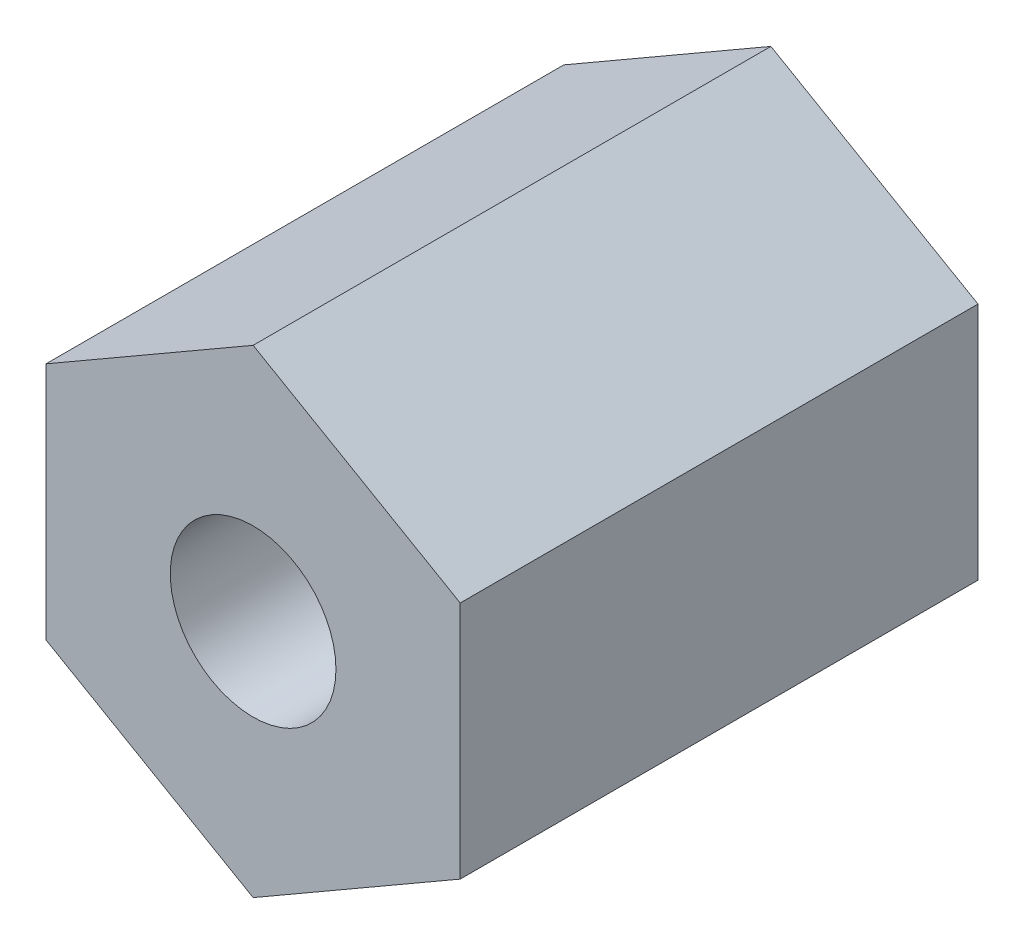
ISO-10303-21;
HEADER;
FILE_DESCRIPTION(('STEP AP214'),'2;1');
FILE_NAME('part.step','',(''),(''),'','','');
FILE_SCHEMA(('AUTOMOTIVE_DESIGN { 1 0 10303 214 1 1 1 1 }'));
ENDSEC;
DATA;
#1=APPLICATION_CONTEXT('core data for automotive mechanical design processes');
#2=APPLICATION_PROTOCOL_DEFINITION('international standard','automotive_design',2000,#1);
#3=PRODUCT_CONTEXT('',#1,'mechanical');
#4=PRODUCT('Part','Part','',(#3));
#5=PRODUCT_RELATED_PRODUCT_CATEGORY('part','',(#4));
#6=PRODUCT_DEFINITION_FORMATION('','',#4);
#7=PRODUCT_DEFINITION_CONTEXT('part definition',#1,'design');
#8=PRODUCT_DEFINITION('design','',#6,#7);
#9=PRODUCT_DEFINITION_SHAPE('','',#8);
#10=(LENGTH_UNIT() NAMED_UNIT(*) SI_UNIT(.MILLI.,.METRE.));
#11=(NAMED_UNIT(*) PLANE_ANGLE_UNIT() SI_UNIT($,.RADIAN.));
#12=(NAMED_UNIT(*) SI_UNIT($,.STERADIAN.) SOLID_ANGLE_UNIT());
#13=UNCERTAINTY_MEASURE_WITH_UNIT(LENGTH_MEASURE(1.E-05),#10,'distance_accuracy_value','');
#14=(GEOMETRIC_REPRESENTATION_CONTEXT(3) GLOBAL_UNCERTAINTY_ASSIGNED_CONTEXT((#13)) GLOBAL_UNIT_ASSIGNED_CONTEXT((#10,
#11,#12)) REPRESENTATION_CONTEXT('',''));
#15=CARTESIAN_POINT('',(0.,0.,0.));
#16=DIRECTION('',(0.,0.,1.));
#17=DIRECTION('',(1.,0.,0.));
#18=AXIS2_PLACEMENT_3D('',#15,#16,#17);
#19=CARTESIAN_POINT('',(0.,0.,5.));
#20=DIRECTION('',(0.,0.,1.));
#21=DIRECTION('',(1.,0.,0.));
#22=AXIS2_PLACEMENT_3D('',#19,#20,#21);
#23=PLANE('',#22);
#24=DIRECTION('',(0.,1.,0.));
#25=VECTOR('',#24,1.);
#26=CARTESIAN_POINT('',(2.,-1.15470053837925,5.));
#27=LINE('',#26,#25);
#28=CARTESIAN_POINT('',(2.,-1.15470053837925,5.));
#29=VERTEX_POINT('',#28);
#30=CARTESIAN_POINT('',(2.,1.15470053837925,5.));
#31=VERTEX_POINT('',#30);
#32=EDGE_CURVE('E137',#29,#31,#27,.T.);
#33=ORIENTED_EDGE('',*,*,#32,.T.);
#34=DIRECTION('',(-0.866025403784439,0.5,0.));
#35=VECTOR('',#34,1.);
#36=CARTESIAN_POINT('',(2.,1.15470053837925,5.));
#37=LINE('',#36,#35);
#38=CARTESIAN_POINT('',(0.,2.3094010767585,5.));
#39=VERTEX_POINT('',#38);
#40=EDGE_CURVE('E95',#31,#39,#37,.T.);
#41=ORIENTED_EDGE('',*,*,#40,.T.);
#42=DIRECTION('',(-0.866025403784439,-0.5,0.));
#43=VECTOR('',#42,1.);
#44=CARTESIAN_POINT('',(0.,2.3094010767585,5.));
#45=LINE('',#44,#43);
#46=CARTESIAN_POINT('',(-2.,1.15470053837925,5.));
#47=VERTEX_POINT('',#46);
#48=EDGE_CURVE('E108',#39,#47,#45,.T.);
#49=ORIENTED_EDGE('',*,*,#48,.T.);
#50=DIRECTION('',(0.,-1.,0.));
#51=VECTOR('',#50,1.);
#52=CARTESIAN_POINT('',(-2.,1.15470053837925,5.));
#53=LINE('',#52,#51);
#54=CARTESIAN_POINT('',(-2.,-1.15470053837925,5.));
#55=VERTEX_POINT('',#54);
#56=EDGE_CURVE('E102',#47,#55,#53,.T.);
#57=ORIENTED_EDGE('',*,*,#56,.T.);
#58=DIRECTION('',(0.866025403784439,-0.5,0.));
#59=VECTOR('',#58,1.);
#60=CARTESIAN_POINT('',(-2.,-1.15470053837925,5.));
#61=LINE('',#60,#59);
#62=CARTESIAN_POINT('',(0.,-2.3094010767585,5.));
#63=VERTEX_POINT('',#62);
#64=EDGE_CURVE('E106',#55,#63,#61,.T.);
#65=ORIENTED_EDGE('',*,*,#64,.T.);
#66=DIRECTION('',(0.866025403784439,0.5,0.));
#67=VECTOR('',#66,1.);
#68=CARTESIAN_POINT('',(0.,-2.3094010767585,5.));
#69=LINE('',#68,#67);
#70=EDGE_CURVE('E58',#63,#29,#69,.T.);
#71=ORIENTED_EDGE('',*,*,#70,.T.);
#72=EDGE_LOOP('',(#33,#41,#49,#57,#65,#71));
#73=FACE_BOUND('',#72,.T.);
#74=CARTESIAN_POINT('',(0.,0.,5.));
#75=DIRECTION('',(0.,0.,1.));
#76=DIRECTION('',(1.,0.,0.));
#77=AXIS2_PLACEMENT_3D('',#74,#75,#76);
#78=CIRCLE('',#77,0.8);
#79=CARTESIAN_POINT('',(0.8,0.,5.));
#80=VERTEX_POINT('',#79);
#81=EDGE_CURVE('E130',#80,#80,#78,.T.);
#82=ORIENTED_EDGE('',*,*,#81,.F.);
#83=EDGE_LOOP('',(#82));
#84=FACE_BOUND('',#83,.T.);
#85=ADVANCED_FACE('F41',(#73,#84),#23,.T.);
#86=CARTESIAN_POINT('',(0.,0.,0.));
#87=DIRECTION('',(0.,0.,1.));
#88=DIRECTION('',(1.,0.,0.));
#89=AXIS2_PLACEMENT_3D('',#86,#87,#88);
#90=PLANE('',#89);
#91=DIRECTION('',(0.,1.,0.));
#92=VECTOR('',#91,1.);
#93=CARTESIAN_POINT('',(2.,-1.15470053837925,0.));
#94=LINE('',#93,#92);
#95=CARTESIAN_POINT('',(2.,-1.15470053837925,0.));
#96=VERTEX_POINT('',#95);
#97=CARTESIAN_POINT('',(2.,1.15470053837925,0.));
#98=VERTEX_POINT('',#97);
#99=EDGE_CURVE('E126',#96,#98,#94,.T.);
#100=ORIENTED_EDGE('',*,*,#99,.F.);
#101=DIRECTION('',(0.866025403784439,0.5,0.));
#102=VECTOR('',#101,1.);
#103=CARTESIAN_POINT('',(0.,-2.3094010767585,0.));
#104=LINE('',#103,#102);
#105=CARTESIAN_POINT('',(0.,-2.3094010767585,0.));
#106=VERTEX_POINT('',#105);
#107=EDGE_CURVE('E87',#106,#96,#104,.T.);
#108=ORIENTED_EDGE('',*,*,#107,.F.);
#109=DIRECTION('',(0.866025403784439,-0.5,0.));
#110=VECTOR('',#109,1.);
#111=CARTESIAN_POINT('',(-2.,-1.15470053837925,0.));
#112=LINE('',#111,#110);
#113=CARTESIAN_POINT('',(-2.,-1.15470053837925,0.));
#114=VERTEX_POINT('',#113);
#115=EDGE_CURVE('E81',#114,#106,#112,.T.);
#116=ORIENTED_EDGE('',*,*,#115,.F.);
#117=DIRECTION('',(0.,-1.,0.));
#118=VECTOR('',#117,1.);
#119=CARTESIAN_POINT('',(-2.,1.15470053837925,0.));
#120=LINE('',#119,#118);
#121=CARTESIAN_POINT('',(-2.,1.15470053837925,0.));
#122=VERTEX_POINT('',#121);
#123=EDGE_CURVE('E116',#122,#114,#120,.T.);
#124=ORIENTED_EDGE('',*,*,#123,.F.);
#125=DIRECTION('',(-0.866025403784439,-0.5,0.));
#126=VECTOR('',#125,1.);
#127=CARTESIAN_POINT('',(0.,2.3094010767585,0.));
#128=LINE('',#127,#126);
#129=CARTESIAN_POINT('',(0.,2.3094010767585,0.));
#130=VERTEX_POINT('',#129);
#131=EDGE_CURVE('E132',#130,#122,#128,.T.);
#132=ORIENTED_EDGE('',*,*,#131,.F.);
#133=DIRECTION('',(-0.866025403784439,0.5,0.));
#134=VECTOR('',#133,1.);
#135=CARTESIAN_POINT('',(2.,1.15470053837925,0.));
#136=LINE('',#135,#134);
#137=EDGE_CURVE('E129',#98,#130,#136,.T.);
#138=ORIENTED_EDGE('',*,*,#137,.F.);
#139=EDGE_LOOP('',(#100,#108,#116,#124,#132,#138));
#140=FACE_BOUND('',#139,.T.);
#141=CARTESIAN_POINT('',(0.,0.,0.));
#142=DIRECTION('',(0.,0.,1.));
#143=DIRECTION('',(1.,0.,0.));
#144=AXIS2_PLACEMENT_3D('',#141,#142,#143);
#145=CIRCLE('',#144,0.8);
#146=CARTESIAN_POINT('',(0.8,0.,0.));
#147=VERTEX_POINT('',#146);
#148=EDGE_CURVE('E230',#147,#147,#145,.T.);
#149=ORIENTED_EDGE('',*,*,#148,.T.);
#150=EDGE_LOOP('',(#149));
#151=FACE_BOUND('',#150,.T.);
#152=ADVANCED_FACE('F146',(#140,#151),#90,.F.);
#153=CARTESIAN_POINT('',(2.,-1.15470053837925,5.));
#154=DIRECTION('',(-1.,0.,0.));
#155=DIRECTION('',(0.,0.,1.));
#156=AXIS2_PLACEMENT_3D('',#153,#154,#155);
#157=PLANE('',#156);
#158=ORIENTED_EDGE('',*,*,#99,.T.);
#159=DIRECTION('',(0.,0.,-1.));
#160=VECTOR('',#159,1.);
#161=CARTESIAN_POINT('',(2.,1.15470053837925,5.));
#162=LINE('',#161,#160);
#163=EDGE_CURVE('E11',#31,#98,#162,.T.);
#164=ORIENTED_EDGE('',*,*,#163,.F.);
#165=ORIENTED_EDGE('',*,*,#32,.F.);
#166=DIRECTION('',(0.,0.,-1.));
#167=VECTOR('',#166,1.);
#168=CARTESIAN_POINT('',(2.,-1.15470053837925,5.));
#169=LINE('',#168,#167);
#170=EDGE_CURVE('E122',#29,#96,#169,.T.);
#171=ORIENTED_EDGE('',*,*,#170,.T.);
#172=EDGE_LOOP('',(#158,#164,#165,#171));
#173=FACE_BOUND('',#172,.T.);
#174=ADVANCED_FACE('F43',(#173),#157,.F.);
#175=CARTESIAN_POINT('',(2.,1.15470053837925,5.));
#176=DIRECTION('',(-0.5,-0.866025403784439,0.));
#177=DIRECTION('',(0.866025403784439,-0.5,0.));
#178=AXIS2_PLACEMENT_3D('',#175,#176,#177);
#179=PLANE('',#178);
#180=ORIENTED_EDGE('',*,*,#137,.T.);
#181=DIRECTION('',(0.,0.,-1.));
#182=VECTOR('',#181,1.);
#183=CARTESIAN_POINT('',(0.,2.3094010767585,5.));
#184=LINE('',#183,#182);
#185=EDGE_CURVE('E50',#39,#130,#184,.T.);
#186=ORIENTED_EDGE('',*,*,#185,.F.);
#187=ORIENTED_EDGE('',*,*,#40,.F.);
#188=ORIENTED_EDGE('',*,*,#163,.T.);
#189=EDGE_LOOP('',(#180,#186,#187,#188));
#190=FACE_BOUND('',#189,.T.);
#191=ADVANCED_FACE('F171',(#190),#179,.F.);
#192=CARTESIAN_POINT('',(0.,2.3094010767585,5.));
#193=DIRECTION('',(0.5,-0.866025403784439,0.));
#194=DIRECTION('',(0.866025403784439,0.5,0.));
#195=AXIS2_PLACEMENT_3D('',#192,#193,#194);
#196=PLANE('',#195);
#197=ORIENTED_EDGE('',*,*,#131,.T.);
#198=DIRECTION('',(0.,0.,-1.));
#199=VECTOR('',#198,1.);
#200=CARTESIAN_POINT('',(-2.,1.15470053837925,5.));
#201=LINE('',#200,#199);
#202=EDGE_CURVE('E117',#47,#122,#201,.T.);
#203=ORIENTED_EDGE('',*,*,#202,.F.);
#204=ORIENTED_EDGE('',*,*,#48,.F.);
#205=ORIENTED_EDGE('',*,*,#185,.T.);
#206=EDGE_LOOP('',(#197,#203,#204,#205));
#207=FACE_BOUND('',#206,.T.);
#208=ADVANCED_FACE('F143',(#207),#196,.F.);
#209=CARTESIAN_POINT('',(-2.,1.15470053837925,5.));
#210=DIRECTION('',(1.,0.,0.));
#211=DIRECTION('',(0.,1.,0.));
#212=AXIS2_PLACEMENT_3D('',#209,#210,#211);
#213=PLANE('',#212);
#214=ORIENTED_EDGE('',*,*,#123,.T.);
#215=DIRECTION('',(0.,0.,-1.));
#216=VECTOR('',#215,1.);
#217=CARTESIAN_POINT('',(-2.,-1.15470053837925,5.));
#218=LINE('',#217,#216);
#219=EDGE_CURVE('E113',#55,#114,#218,.T.);
#220=ORIENTED_EDGE('',*,*,#219,.F.);
#221=ORIENTED_EDGE('',*,*,#56,.F.);
#222=ORIENTED_EDGE('',*,*,#202,.T.);
#223=EDGE_LOOP('',(#214,#220,#221,#222));
#224=FACE_BOUND('',#223,.T.);
#225=ADVANCED_FACE('F114',(#224),#213,.F.);
#226=CARTESIAN_POINT('',(-2.,-1.15470053837925,5.));
#227=DIRECTION('',(0.5,0.866025403784438,0.));
#228=DIRECTION('',(-0.866025403784438,0.5,0.));
#229=AXIS2_PLACEMENT_3D('',#226,#227,#228);
#230=PLANE('',#229);
#231=ORIENTED_EDGE('',*,*,#115,.T.);
#232=DIRECTION('',(0.,0.,-1.));
#233=VECTOR('',#232,1.);
#234=CARTESIAN_POINT('',(0.,-2.3094010767585,5.));
#235=LINE('',#234,#233);
#236=EDGE_CURVE('E118',#63,#106,#235,.T.);
#237=ORIENTED_EDGE('',*,*,#236,.F.);
#238=ORIENTED_EDGE('',*,*,#64,.F.);
#239=ORIENTED_EDGE('',*,*,#219,.T.);
#240=EDGE_LOOP('',(#231,#237,#238,#239));
#241=FACE_BOUND('',#240,.T.);
#242=ADVANCED_FACE('F120',(#241),#230,.F.);
#243=CARTESIAN_POINT('',(0.,-2.3094010767585,5.));
#244=DIRECTION('',(-0.5,0.866025403784439,0.));
#245=DIRECTION('',(-0.866025403784439,-0.5,0.));
#246=AXIS2_PLACEMENT_3D('',#243,#244,#245);
#247=PLANE('',#246);
#248=ORIENTED_EDGE('',*,*,#107,.T.);
#249=ORIENTED_EDGE('',*,*,#170,.F.);
#250=ORIENTED_EDGE('',*,*,#70,.F.);
#251=ORIENTED_EDGE('',*,*,#236,.T.);
#252=EDGE_LOOP('',(#248,#249,#250,#251));
#253=FACE_BOUND('',#252,.T.);
#254=ADVANCED_FACE('F151',(#253),#247,.F.);
#255=CARTESIAN_POINT('',(0.,0.,5.));
#256=DIRECTION('',(0.,0.,-1.));
#257=DIRECTION('',(-1.,0.,0.));
#258=AXIS2_PLACEMENT_3D('',#255,#256,#257);
#259=CYLINDRICAL_SURFACE('',#258,0.8);
#260=ORIENTED_EDGE('',*,*,#81,.T.);
#261=EDGE_LOOP('',(#260));
#262=FACE_BOUND('',#261,.T.);
#263=ORIENTED_EDGE('',*,*,#148,.F.);
#264=EDGE_LOOP('',(#263));
#265=FACE_BOUND('',#264,.T.);
#266=ADVANCED_FACE('F153',(#262,#265),#259,.F.);
#267=CLOSED_SHELL('',(#85,#152,#174,#191,#208,#225,#242,#254,#266));
#268=MANIFOLD_SOLID_BREP('B2',#267);
#269=ADVANCED_BREP_SHAPE_REPRESENTATION('',(#18,#268),#14);
#270=SHAPE_DEFINITION_REPRESENTATION(#9,#269);
ENDSEC;
END-ISO-10303-21;
